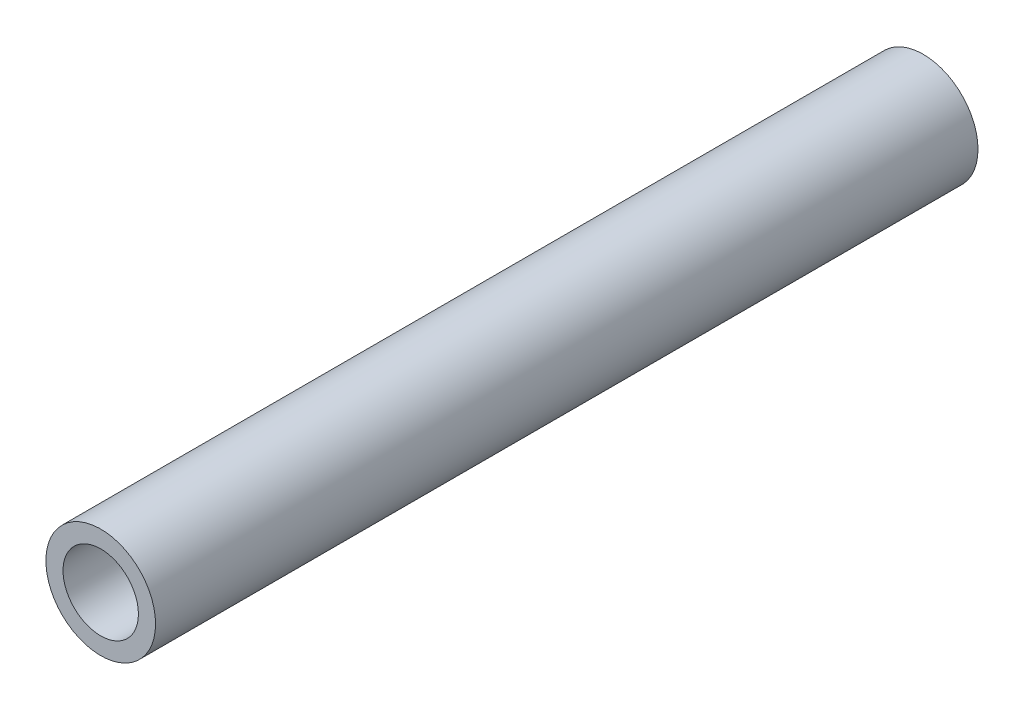
ISO-10303-21;
HEADER;
FILE_DESCRIPTION(('STEP AP214'),'2;1');
FILE_NAME('part.step','',(''),(''),'','','');
FILE_SCHEMA(('AUTOMOTIVE_DESIGN { 1 0 10303 214 1 1 1 1 }'));
ENDSEC;
DATA;
#1=APPLICATION_CONTEXT('core data for automotive mechanical design processes');
#2=APPLICATION_PROTOCOL_DEFINITION('international standard','automotive_design',2000,#1);
#3=PRODUCT_CONTEXT('',#1,'mechanical');
#4=PRODUCT('Part','Part','',(#3));
#5=PRODUCT_RELATED_PRODUCT_CATEGORY('part','',(#4));
#6=PRODUCT_DEFINITION_FORMATION('','',#4);
#7=PRODUCT_DEFINITION_CONTEXT('part definition',#1,'design');
#8=PRODUCT_DEFINITION('design','',#6,#7);
#9=PRODUCT_DEFINITION_SHAPE('','',#8);
#10=(LENGTH_UNIT() NAMED_UNIT(*) SI_UNIT(.MILLI.,.METRE.));
#11=(NAMED_UNIT(*) PLANE_ANGLE_UNIT() SI_UNIT($,.RADIAN.));
#12=(NAMED_UNIT(*) SI_UNIT($,.STERADIAN.) SOLID_ANGLE_UNIT());
#13=UNCERTAINTY_MEASURE_WITH_UNIT(LENGTH_MEASURE(1.E-05),#10,'distance_accuracy_value','');
#14=(GEOMETRIC_REPRESENTATION_CONTEXT(3) GLOBAL_UNCERTAINTY_ASSIGNED_CONTEXT((#13)) GLOBAL_UNIT_ASSIGNED_CONTEXT((#10,
#11,#12)) REPRESENTATION_CONTEXT('',''));
#15=CARTESIAN_POINT('',(0.,0.,0.));
#16=DIRECTION('',(0.,0.,1.));
#17=DIRECTION('',(1.,0.,0.));
#18=AXIS2_PLACEMENT_3D('',#15,#16,#17);
#19=CARTESIAN_POINT('',(0.,0.,60.));
#20=DIRECTION('',(0.,0.,-1.));
#21=DIRECTION('',(-1.,0.,0.));
#22=AXIS2_PLACEMENT_3D('',#19,#20,#21);
#23=CYLINDRICAL_SURFACE('',#22,4.);
#24=CARTESIAN_POINT('',(0.,0.,60.));
#25=DIRECTION('',(0.,0.,1.));
#26=DIRECTION('',(1.,0.,0.));
#27=AXIS2_PLACEMENT_3D('',#24,#25,#26);
#28=CIRCLE('',#27,4.);
#29=CARTESIAN_POINT('',(4.,0.,60.));
#30=VERTEX_POINT('',#29);
#31=EDGE_CURVE('E10',#30,#30,#28,.T.);
#32=ORIENTED_EDGE('',*,*,#31,.F.);
#33=EDGE_LOOP('',(#32));
#34=FACE_BOUND('',#33,.T.);
#35=CARTESIAN_POINT('',(0.,0.,0.));
#36=DIRECTION('',(0.,0.,1.));
#37=DIRECTION('',(1.,0.,0.));
#38=AXIS2_PLACEMENT_3D('',#35,#36,#37);
#39=CIRCLE('',#38,4.);
#40=CARTESIAN_POINT('',(4.,0.,0.));
#41=VERTEX_POINT('',#40);
#42=EDGE_CURVE('E34',#41,#41,#39,.T.);
#43=ORIENTED_EDGE('',*,*,#42,.T.);
#44=EDGE_LOOP('',(#43));
#45=FACE_BOUND('',#44,.T.);
#46=ADVANCED_FACE('F31',(#34,#45),#23,.T.);
#47=CARTESIAN_POINT('',(0.,0.,60.));
#48=DIRECTION('',(0.,0.,1.));
#49=DIRECTION('',(1.,0.,0.));
#50=AXIS2_PLACEMENT_3D('',#47,#48,#49);
#51=PLANE('',#50);
#52=CARTESIAN_POINT('',(0.,0.,60.));
#53=DIRECTION('',(0.,0.,1.));
#54=DIRECTION('',(1.,0.,0.));
#55=AXIS2_PLACEMENT_3D('',#52,#53,#54);
#56=CIRCLE('',#55,2.74999999999999);
#57=CARTESIAN_POINT('',(2.74999999999999,0.,60.));
#58=VERTEX_POINT('',#57);
#59=EDGE_CURVE('E45',#58,#58,#56,.T.);
#60=ORIENTED_EDGE('',*,*,#59,.F.);
#61=EDGE_LOOP('',(#60));
#62=FACE_BOUND('',#61,.T.);
#63=ORIENTED_EDGE('',*,*,#31,.T.);
#64=EDGE_LOOP('',(#63));
#65=FACE_BOUND('',#64,.T.);
#66=ADVANCED_FACE('F51',(#62,#65),#51,.T.);
#67=CARTESIAN_POINT('',(0.,0.,0.));
#68=DIRECTION('',(0.,0.,1.));
#69=DIRECTION('',(1.,0.,0.));
#70=AXIS2_PLACEMENT_3D('',#67,#68,#69);
#71=PLANE('',#70);
#72=CARTESIAN_POINT('',(0.,0.,0.));
#73=DIRECTION('',(0.,0.,1.));
#74=DIRECTION('',(1.,0.,0.));
#75=AXIS2_PLACEMENT_3D('',#72,#73,#74);
#76=CIRCLE('',#75,2.74999999999999);
#77=CARTESIAN_POINT('',(2.74999999999999,0.,0.));
#78=VERTEX_POINT('',#77);
#79=EDGE_CURVE('E41',#78,#78,#76,.T.);
#80=ORIENTED_EDGE('',*,*,#79,.T.);
#81=EDGE_LOOP('',(#80));
#82=FACE_BOUND('',#81,.T.);
#83=ORIENTED_EDGE('',*,*,#42,.F.);
#84=EDGE_LOOP('',(#83));
#85=FACE_BOUND('',#84,.T.);
#86=ADVANCED_FACE('F53',(#82,#85),#71,.F.);
#87=CARTESIAN_POINT('',(0.,0.,60.));
#88=DIRECTION('',(0.,0.,1.));
#89=DIRECTION('',(1.,0.,0.));
#90=AXIS2_PLACEMENT_3D('',#87,#88,#89);
#91=CYLINDRICAL_SURFACE('',#90,2.74999999999999);
#92=ORIENTED_EDGE('',*,*,#79,.F.);
#93=EDGE_LOOP('',(#92));
#94=FACE_BOUND('',#93,.T.);
#95=ORIENTED_EDGE('',*,*,#59,.T.);
#96=EDGE_LOOP('',(#95));
#97=FACE_BOUND('',#96,.T.);
#98=ADVANCED_FACE('F49',(#94,#97),#91,.F.);
#99=CLOSED_SHELL('',(#46,#66,#86,#98));
#100=MANIFOLD_SOLID_BREP('B2',#99);
#101=ADVANCED_BREP_SHAPE_REPRESENTATION('',(#18,#100),#14);
#102=SHAPE_DEFINITION_REPRESENTATION(#9,#101);
ENDSEC;
END-ISO-10303-21;
